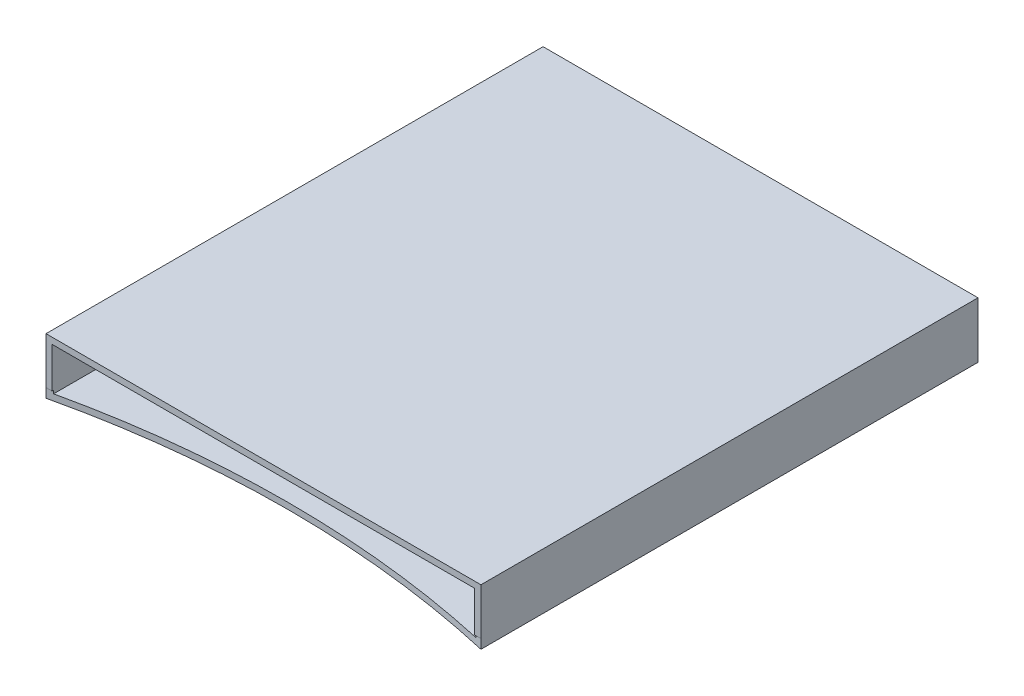
ISO-10303-21;
HEADER;
FILE_DESCRIPTION(('STEP AP214'),'2;1');
FILE_NAME('part.step','',(''),(''),'','','');
FILE_SCHEMA(('AUTOMOTIVE_DESIGN { 1 0 10303 214 1 1 1 1 }'));
ENDSEC;
DATA;
#1=APPLICATION_CONTEXT('core data for automotive mechanical design processes');
#2=APPLICATION_PROTOCOL_DEFINITION('international standard','automotive_design',2000,#1);
#3=PRODUCT_CONTEXT('',#1,'mechanical');
#4=PRODUCT('Part','Part','',(#3));
#5=PRODUCT_RELATED_PRODUCT_CATEGORY('part','',(#4));
#6=PRODUCT_DEFINITION_FORMATION('','',#4);
#7=PRODUCT_DEFINITION_CONTEXT('part definition',#1,'design');
#8=PRODUCT_DEFINITION('design','',#6,#7);
#9=PRODUCT_DEFINITION_SHAPE('','',#8);
#10=(LENGTH_UNIT() NAMED_UNIT(*) SI_UNIT(.MILLI.,.METRE.));
#11=(NAMED_UNIT(*) PLANE_ANGLE_UNIT() SI_UNIT($,.RADIAN.));
#12=(NAMED_UNIT(*) SI_UNIT($,.STERADIAN.) SOLID_ANGLE_UNIT());
#13=UNCERTAINTY_MEASURE_WITH_UNIT(LENGTH_MEASURE(1.E-05),#10,'distance_accuracy_value','');
#14=(GEOMETRIC_REPRESENTATION_CONTEXT(3) GLOBAL_UNCERTAINTY_ASSIGNED_CONTEXT((#13)) GLOBAL_UNIT_ASSIGNED_CONTEXT((#10,
#11,#12)) REPRESENTATION_CONTEXT('',''));
#15=CARTESIAN_POINT('',(0.,0.,0.));
#16=DIRECTION('',(0.,0.,1.));
#17=DIRECTION('',(1.,0.,0.));
#18=AXIS2_PLACEMENT_3D('',#15,#16,#17);
#19=CARTESIAN_POINT('',(-6.99999999999999,1.8,8.));
#20=DIRECTION('',(0.,0.,-1.));
#21=DIRECTION('',(-1.,0.,0.));
#22=AXIS2_PLACEMENT_3D('',#19,#20,#21);
#23=PLANE('',#22);
#24=DIRECTION('',(0.,-1.,0.));
#25=VECTOR('',#24,1.);
#26=CARTESIAN_POINT('',(-6.99999999999999,1.8,8.));
#27=LINE('',#26,#25);
#28=CARTESIAN_POINT('',(-6.99999999999999,1.8,8.));
#29=VERTEX_POINT('',#28);
#30=CARTESIAN_POINT('',(-6.99999999999999,0.3,8.));
#31=VERTEX_POINT('',#30);
#32=EDGE_CURVE('E163',#29,#31,#27,.T.);
#33=ORIENTED_EDGE('',*,*,#32,.T.);
#34=DIRECTION('',(-1.,0.,0.));
#35=VECTOR('',#34,1.);
#36=CARTESIAN_POINT('',(7.,0.3,8.));
#37=LINE('',#36,#35);
#38=CARTESIAN_POINT('',(-6.79999999999999,0.3,8.));
#39=VERTEX_POINT('',#38);
#40=EDGE_CURVE('E262',#39,#31,#37,.T.);
#41=ORIENTED_EDGE('',*,*,#40,.F.);
#42=DIRECTION('',(0.,-1.,0.));
#43=VECTOR('',#42,1.);
#44=CARTESIAN_POINT('',(-6.79999999999999,1.8,8.));
#45=LINE('',#44,#43);
#46=CARTESIAN_POINT('',(-6.79999999999999,1.6,8.));
#47=VERTEX_POINT('',#46);
#48=EDGE_CURVE('E145',#47,#39,#45,.T.);
#49=ORIENTED_EDGE('',*,*,#48,.F.);
#50=DIRECTION('',(1.,0.,0.));
#51=VECTOR('',#50,1.);
#52=CARTESIAN_POINT('',(-6.99999999999999,1.6,8.));
#53=LINE('',#52,#51);
#54=CARTESIAN_POINT('',(6.80000000000001,1.6,8.));
#55=VERTEX_POINT('',#54);
#56=EDGE_CURVE('E187',#47,#55,#53,.T.);
#57=ORIENTED_EDGE('',*,*,#56,.T.);
#58=DIRECTION('',(0.,-1.,0.));
#59=VECTOR('',#58,1.);
#60=CARTESIAN_POINT('',(6.80000000000001,1.8,8.));
#61=LINE('',#60,#59);
#62=CARTESIAN_POINT('',(6.80000000000001,0.3,8.));
#63=VERTEX_POINT('',#62);
#64=EDGE_CURVE('E196',#55,#63,#61,.T.);
#65=ORIENTED_EDGE('',*,*,#64,.T.);
#66=CARTESIAN_POINT('',(7.,0.3,8.));
#67=VERTEX_POINT('',#66);
#68=EDGE_CURVE('E136',#67,#63,#37,.T.);
#69=ORIENTED_EDGE('',*,*,#68,.F.);
#70=DIRECTION('',(0.,-1.,0.));
#71=VECTOR('',#70,1.);
#72=CARTESIAN_POINT('',(7.,1.8,8.));
#73=LINE('',#72,#71);
#74=CARTESIAN_POINT('',(7.,1.8,8.));
#75=VERTEX_POINT('',#74);
#76=EDGE_CURVE('E135',#75,#67,#73,.T.);
#77=ORIENTED_EDGE('',*,*,#76,.F.);
#78=DIRECTION('',(1.,0.,0.));
#79=VECTOR('',#78,1.);
#80=CARTESIAN_POINT('',(-6.99999999999999,1.8,8.));
#81=LINE('',#80,#79);
#82=EDGE_CURVE('E151',#29,#75,#81,.T.);
#83=ORIENTED_EDGE('',*,*,#82,.F.);
#84=EDGE_LOOP('',(#33,#41,#49,#57,#65,#69,#77,#83));
#85=FACE_BOUND('',#84,.T.);
#86=ADVANCED_FACE('F29',(#85),#23,.F.);
#87=CARTESIAN_POINT('',(-6.99999999999999,1.8,-8.));
#88=DIRECTION('',(1.,0.,0.));
#89=DIRECTION('',(0.,0.,-1.));
#90=AXIS2_PLACEMENT_3D('',#87,#88,#89);
#91=PLANE('',#90);
#92=DIRECTION('',(0.,0.,1.));
#93=VECTOR('',#92,1.);
#94=CARTESIAN_POINT('',(-6.99999999999999,0.,-8.));
#95=LINE('',#94,#93);
#96=CARTESIAN_POINT('',(-6.99999999999999,0.,-8.));
#97=VERTEX_POINT('',#96);
#98=CARTESIAN_POINT('',(-6.99999999999999,0.,8.));
#99=VERTEX_POINT('',#98);
#100=EDGE_CURVE('E141',#97,#99,#95,.T.);
#101=ORIENTED_EDGE('',*,*,#100,.T.);
#102=DIRECTION('',(0.,-1.,0.));
#103=VECTOR('',#102,1.);
#104=CARTESIAN_POINT('',(-6.99999999999999,0.3,8.));
#105=LINE('',#104,#103);
#106=EDGE_CURVE('E120',#31,#99,#105,.T.);
#107=ORIENTED_EDGE('',*,*,#106,.F.);
#108=ORIENTED_EDGE('',*,*,#32,.F.);
#109=DIRECTION('',(0.,0.,1.));
#110=VECTOR('',#109,1.);
#111=CARTESIAN_POINT('',(-6.99999999999999,1.8,-8.));
#112=LINE('',#111,#110);
#113=CARTESIAN_POINT('',(-6.99999999999999,1.8,-8.));
#114=VERTEX_POINT('',#113);
#115=EDGE_CURVE('E143',#114,#29,#112,.T.);
#116=ORIENTED_EDGE('',*,*,#115,.F.);
#117=DIRECTION('',(0.,-1.,0.));
#118=VECTOR('',#117,1.);
#119=CARTESIAN_POINT('',(-6.99999999999999,1.8,-8.));
#120=LINE('',#119,#118);
#121=EDGE_CURVE('E157',#114,#97,#120,.T.);
#122=ORIENTED_EDGE('',*,*,#121,.T.);
#123=EDGE_LOOP('',(#101,#107,#108,#116,#122));
#124=FACE_BOUND('',#123,.T.);
#125=ADVANCED_FACE('F31',(#124),#91,.F.);
#126=CARTESIAN_POINT('',(7.00000000000001,1.8,-8.));
#127=DIRECTION('',(-1.,0.,0.));
#128=DIRECTION('',(0.,0.,1.));
#129=AXIS2_PLACEMENT_3D('',#126,#127,#128);
#130=PLANE('',#129);
#131=DIRECTION('',(0.,0.,-1.));
#132=VECTOR('',#131,1.);
#133=CARTESIAN_POINT('',(7.00000000000001,0.,-8.));
#134=LINE('',#133,#132);
#135=CARTESIAN_POINT('',(7.,0.,8.));
#136=VERTEX_POINT('',#135);
#137=CARTESIAN_POINT('',(7.00000000000001,0.,-8.));
#138=VERTEX_POINT('',#137);
#139=EDGE_CURVE('E131',#136,#138,#134,.T.);
#140=ORIENTED_EDGE('',*,*,#139,.T.);
#141=DIRECTION('',(0.,-1.,0.));
#142=VECTOR('',#141,1.);
#143=CARTESIAN_POINT('',(7.00000000000001,1.8,-8.));
#144=LINE('',#143,#142);
#145=CARTESIAN_POINT('',(7.00000000000001,1.8,-8.));
#146=VERTEX_POINT('',#145);
#147=EDGE_CURVE('E160',#146,#138,#144,.T.);
#148=ORIENTED_EDGE('',*,*,#147,.F.);
#149=DIRECTION('',(0.,0.,-1.));
#150=VECTOR('',#149,1.);
#151=CARTESIAN_POINT('',(7.00000000000001,1.8,-8.));
#152=LINE('',#151,#150);
#153=EDGE_CURVE('E153',#75,#146,#152,.T.);
#154=ORIENTED_EDGE('',*,*,#153,.F.);
#155=ORIENTED_EDGE('',*,*,#76,.T.);
#156=DIRECTION('',(0.,-1.,0.));
#157=VECTOR('',#156,1.);
#158=CARTESIAN_POINT('',(7.,0.3,8.));
#159=LINE('',#158,#157);
#160=EDGE_CURVE('E116',#67,#136,#159,.T.);
#161=ORIENTED_EDGE('',*,*,#160,.T.);
#162=EDGE_LOOP('',(#140,#148,#154,#155,#161));
#163=FACE_BOUND('',#162,.T.);
#164=ADVANCED_FACE('F129',(#163),#130,.F.);
#165=CARTESIAN_POINT('',(-6.99999999999999,1.8,-8.));
#166=DIRECTION('',(0.,0.,1.));
#167=DIRECTION('',(1.,0.,0.));
#168=AXIS2_PLACEMENT_3D('',#165,#166,#167);
#169=PLANE('',#168);
#170=DIRECTION('',(-1.,0.,0.));
#171=VECTOR('',#170,1.);
#172=CARTESIAN_POINT('',(-6.99999999999999,0.,-8.));
#173=LINE('',#172,#171);
#174=EDGE_CURVE('E140',#138,#97,#173,.T.);
#175=ORIENTED_EDGE('',*,*,#174,.T.);
#176=ORIENTED_EDGE('',*,*,#121,.F.);
#177=DIRECTION('',(-1.,0.,0.));
#178=VECTOR('',#177,1.);
#179=CARTESIAN_POINT('',(-6.99999999999999,1.8,-8.));
#180=LINE('',#179,#178);
#181=EDGE_CURVE('E155',#146,#114,#180,.T.);
#182=ORIENTED_EDGE('',*,*,#181,.F.);
#183=ORIENTED_EDGE('',*,*,#147,.T.);
#184=EDGE_LOOP('',(#175,#176,#182,#183));
#185=FACE_BOUND('',#184,.T.);
#186=ADVANCED_FACE('F232',(#185),#169,.F.);
#187=CARTESIAN_POINT('',(-6.99999999999999,1.8,-8.));
#188=DIRECTION('',(0.,1.,0.));
#189=DIRECTION('',(0.,0.,1.));
#190=AXIS2_PLACEMENT_3D('',#187,#188,#189);
#191=PLANE('',#190);
#192=ORIENTED_EDGE('',*,*,#115,.T.);
#193=ORIENTED_EDGE('',*,*,#82,.T.);
#194=ORIENTED_EDGE('',*,*,#153,.T.);
#195=ORIENTED_EDGE('',*,*,#181,.T.);
#196=EDGE_LOOP('',(#192,#193,#194,#195));
#197=FACE_BOUND('',#196,.T.);
#198=ADVANCED_FACE('F235',(#197),#191,.T.);
#199=CARTESIAN_POINT('',(-6.99999999999999,0.,-8.));
#200=DIRECTION('',(0.,1.,0.));
#201=DIRECTION('',(0.,0.,1.));
#202=AXIS2_PLACEMENT_3D('',#199,#200,#201);
#203=PLANE('',#202);
#204=ORIENTED_EDGE('',*,*,#139,.F.);
#205=CARTESIAN_POINT('',(0.,0.,38.5220015265287));
#206=DIRECTION('',(0.,-1.,0.));
#207=DIRECTION('',(0.,0.,1.));
#208=AXIS2_PLACEMENT_3D('',#205,#206,#207);
#209=CIRCLE('',#208,31.3144148466073);
#210=EDGE_CURVE('E113',#99,#136,#209,.T.);
#211=ORIENTED_EDGE('',*,*,#210,.F.);
#212=ORIENTED_EDGE('',*,*,#100,.F.);
#213=ORIENTED_EDGE('',*,*,#174,.F.);
#214=EDGE_LOOP('',(#204,#211,#212,#213));
#215=FACE_BOUND('',#214,.T.);
#216=ADVANCED_FACE('F139',(#215),#203,.F.);
#217=CARTESIAN_POINT('',(-6.8,1.8,-8.));
#218=DIRECTION('',(1.,0.,0.));
#219=DIRECTION('',(0.,0.,-1.));
#220=AXIS2_PLACEMENT_3D('',#217,#218,#219);
#221=PLANE('',#220);
#222=DIRECTION('',(0.,-1.,0.));
#223=VECTOR('',#222,1.);
#224=CARTESIAN_POINT('',(-6.79999999999999,0.3,7.95482015196588));
#225=LINE('',#224,#223);
#226=CARTESIAN_POINT('',(-6.79999999999999,0.2,7.95482015196588));
#227=VERTEX_POINT('',#226);
#228=CARTESIAN_POINT('',(-6.79999999999999,0.3,7.95482015196588));
#229=VERTEX_POINT('',#228);
#230=EDGE_CURVE('E166',#227,#229,#225,.F.);
#231=ORIENTED_EDGE('',*,*,#230,.F.);
#232=DIRECTION('',(0.,0.,1.));
#233=VECTOR('',#232,1.);
#234=CARTESIAN_POINT('',(-6.8,0.2,-8.));
#235=LINE('',#234,#233);
#236=CARTESIAN_POINT('',(-6.8,0.2,-7.8));
#237=VERTEX_POINT('',#236);
#238=EDGE_CURVE('E174',#237,#227,#235,.T.);
#239=ORIENTED_EDGE('',*,*,#238,.F.);
#240=DIRECTION('',(0.,-1.,0.));
#241=VECTOR('',#240,1.);
#242=CARTESIAN_POINT('',(-6.8,1.8,-7.8));
#243=LINE('',#242,#241);
#244=CARTESIAN_POINT('',(-6.8,1.6,-7.8));
#245=VERTEX_POINT('',#244);
#246=EDGE_CURVE('E188',#245,#237,#243,.T.);
#247=ORIENTED_EDGE('',*,*,#246,.F.);
#248=DIRECTION('',(0.,0.,1.));
#249=VECTOR('',#248,1.);
#250=CARTESIAN_POINT('',(-6.8,1.6,-8.));
#251=LINE('',#250,#249);
#252=EDGE_CURVE('E52',#245,#47,#251,.T.);
#253=ORIENTED_EDGE('',*,*,#252,.T.);
#254=ORIENTED_EDGE('',*,*,#48,.T.);
#255=DIRECTION('',(0.,0.,1.));
#256=VECTOR('',#255,1.);
#257=CARTESIAN_POINT('',(-6.8,0.3,-8.));
#258=LINE('',#257,#256);
#259=EDGE_CURVE('E175',#229,#39,#258,.T.);
#260=ORIENTED_EDGE('',*,*,#259,.F.);
#261=EDGE_LOOP('',(#231,#239,#247,#253,#254,#260));
#262=FACE_BOUND('',#261,.T.);
#263=ADVANCED_FACE('F173',(#262),#221,.T.);
#264=CARTESIAN_POINT('',(6.80000000000001,1.8,-8.));
#265=DIRECTION('',(-1.,0.,0.));
#266=DIRECTION('',(0.,0.,1.));
#267=AXIS2_PLACEMENT_3D('',#264,#265,#266);
#268=PLANE('',#267);
#269=DIRECTION('',(0.,-1.,0.));
#270=VECTOR('',#269,1.);
#271=CARTESIAN_POINT('',(6.80000000000001,0.3,7.95482015196588));
#272=LINE('',#271,#270);
#273=CARTESIAN_POINT('',(6.80000000000001,0.3,7.95482015196588));
#274=VERTEX_POINT('',#273);
#275=CARTESIAN_POINT('',(6.80000000000001,0.2,7.95482015196588));
#276=VERTEX_POINT('',#275);
#277=EDGE_CURVE('E44',#274,#276,#272,.T.);
#278=ORIENTED_EDGE('',*,*,#277,.F.);
#279=DIRECTION('',(0.,0.,-1.));
#280=VECTOR('',#279,1.);
#281=CARTESIAN_POINT('',(6.80000000000001,0.3,-8.));
#282=LINE('',#281,#280);
#283=EDGE_CURVE('E11',#63,#274,#282,.T.);
#284=ORIENTED_EDGE('',*,*,#283,.F.);
#285=ORIENTED_EDGE('',*,*,#64,.F.);
#286=DIRECTION('',(0.,0.,-1.));
#287=VECTOR('',#286,1.);
#288=CARTESIAN_POINT('',(6.80000000000001,1.6,-8.));
#289=LINE('',#288,#287);
#290=CARTESIAN_POINT('',(6.80000000000001,1.6,-7.8));
#291=VERTEX_POINT('',#290);
#292=EDGE_CURVE('E194',#55,#291,#289,.T.);
#293=ORIENTED_EDGE('',*,*,#292,.T.);
#294=DIRECTION('',(0.,-1.,0.));
#295=VECTOR('',#294,1.);
#296=CARTESIAN_POINT('',(6.80000000000001,1.8,-7.8));
#297=LINE('',#296,#295);
#298=CARTESIAN_POINT('',(6.80000000000001,0.2,-7.8));
#299=VERTEX_POINT('',#298);
#300=EDGE_CURVE('E190',#291,#299,#297,.T.);
#301=ORIENTED_EDGE('',*,*,#300,.T.);
#302=DIRECTION('',(0.,0.,-1.));
#303=VECTOR('',#302,1.);
#304=CARTESIAN_POINT('',(6.80000000000001,0.2,-8.));
#305=LINE('',#304,#303);
#306=EDGE_CURVE('E181',#276,#299,#305,.T.);
#307=ORIENTED_EDGE('',*,*,#306,.F.);
#308=EDGE_LOOP('',(#278,#284,#285,#293,#301,#307));
#309=FACE_BOUND('',#308,.T.);
#310=ADVANCED_FACE('F211',(#309),#268,.T.);
#311=CARTESIAN_POINT('',(-6.99999999999999,1.8,-7.8));
#312=DIRECTION('',(0.,0.,1.));
#313=DIRECTION('',(1.,0.,0.));
#314=AXIS2_PLACEMENT_3D('',#311,#312,#313);
#315=PLANE('',#314);
#316=DIRECTION('',(-1.,0.,0.));
#317=VECTOR('',#316,1.);
#318=CARTESIAN_POINT('',(-6.99999999999999,0.2,-7.8));
#319=LINE('',#318,#317);
#320=EDGE_CURVE('E179',#299,#237,#319,.T.);
#321=ORIENTED_EDGE('',*,*,#320,.F.);
#322=ORIENTED_EDGE('',*,*,#300,.F.);
#323=DIRECTION('',(-1.,0.,0.));
#324=VECTOR('',#323,1.);
#325=CARTESIAN_POINT('',(-6.99999999999999,1.6,-7.8));
#326=LINE('',#325,#324);
#327=EDGE_CURVE('E191',#291,#245,#326,.T.);
#328=ORIENTED_EDGE('',*,*,#327,.T.);
#329=ORIENTED_EDGE('',*,*,#246,.T.);
#330=EDGE_LOOP('',(#321,#322,#328,#329));
#331=FACE_BOUND('',#330,.T.);
#332=ADVANCED_FACE('F214',(#331),#315,.T.);
#333=CARTESIAN_POINT('',(-6.99999999999999,1.6,-8.));
#334=DIRECTION('',(0.,1.,0.));
#335=DIRECTION('',(0.,0.,1.));
#336=AXIS2_PLACEMENT_3D('',#333,#334,#335);
#337=PLANE('',#336);
#338=ORIENTED_EDGE('',*,*,#252,.F.);
#339=ORIENTED_EDGE('',*,*,#327,.F.);
#340=ORIENTED_EDGE('',*,*,#292,.F.);
#341=ORIENTED_EDGE('',*,*,#56,.F.);
#342=EDGE_LOOP('',(#338,#339,#340,#341));
#343=FACE_BOUND('',#342,.T.);
#344=ADVANCED_FACE('F207',(#343),#337,.F.);
#345=CARTESIAN_POINT('',(-6.99999999999999,0.2,-8.));
#346=DIRECTION('',(0.,1.,0.));
#347=DIRECTION('',(0.,0.,1.));
#348=AXIS2_PLACEMENT_3D('',#345,#346,#347);
#349=PLANE('',#348);
#350=CARTESIAN_POINT('',(0.,0.2,38.5220015265287));
#351=DIRECTION('',(0.,1.,0.));
#352=DIRECTION('',(0.,0.,1.));
#353=AXIS2_PLACEMENT_3D('',#350,#351,#352);
#354=CIRCLE('',#353,31.3144148466073);
#355=EDGE_CURVE('E37',#276,#227,#354,.T.);
#356=ORIENTED_EDGE('',*,*,#355,.F.);
#357=ORIENTED_EDGE('',*,*,#306,.T.);
#358=ORIENTED_EDGE('',*,*,#320,.T.);
#359=ORIENTED_EDGE('',*,*,#238,.T.);
#360=EDGE_LOOP('',(#356,#357,#358,#359));
#361=FACE_BOUND('',#360,.T.);
#362=ADVANCED_FACE('F177',(#361),#349,.T.);
#363=CARTESIAN_POINT('',(0.,0.3,38.5220015265287));
#364=DIRECTION('',(0.,1.,0.));
#365=DIRECTION('',(0.,0.,1.));
#366=AXIS2_PLACEMENT_3D('',#363,#364,#365);
#367=PLANE('',#366);
#368=ORIENTED_EDGE('',*,*,#259,.T.);
#369=ORIENTED_EDGE('',*,*,#40,.T.);
#370=CARTESIAN_POINT('',(0.,0.3,38.5220015265287));
#371=DIRECTION('',(0.,-1.,0.));
#372=DIRECTION('',(0.,0.,1.));
#373=AXIS2_PLACEMENT_3D('',#370,#371,#372);
#374=CIRCLE('',#373,31.3144148466073);
#375=EDGE_CURVE('E257',#31,#229,#374,.T.);
#376=ORIENTED_EDGE('',*,*,#375,.T.);
#377=EDGE_LOOP('',(#368,#369,#376));
#378=FACE_BOUND('',#377,.T.);
#379=ADVANCED_FACE('F242',(#378),#367,.F.);
#380=CARTESIAN_POINT('',(0.,0.3,38.5220015265287));
#381=DIRECTION('',(0.,-1.,0.));
#382=DIRECTION('',(0.,0.,-1.));
#383=AXIS2_PLACEMENT_3D('',#380,#381,#382);
#384=CYLINDRICAL_SURFACE('',#383,31.3144148466073);
#385=ORIENTED_EDGE('',*,*,#230,.T.);
#386=ORIENTED_EDGE('',*,*,#375,.F.);
#387=ORIENTED_EDGE('',*,*,#106,.T.);
#388=ORIENTED_EDGE('',*,*,#210,.T.);
#389=ORIENTED_EDGE('',*,*,#160,.F.);
#390=EDGE_CURVE('E125',#274,#67,#374,.T.);
#391=ORIENTED_EDGE('',*,*,#390,.F.);
#392=ORIENTED_EDGE('',*,*,#277,.T.);
#393=ORIENTED_EDGE('',*,*,#355,.T.);
#394=EDGE_LOOP('',(#385,#386,#387,#388,#389,#391,#392,#393));
#395=FACE_BOUND('',#394,.T.);
#396=ADVANCED_FACE('F115',(#395),#384,.F.);
#397=ORIENTED_EDGE('',*,*,#283,.T.);
#398=ORIENTED_EDGE('',*,*,#390,.T.);
#399=ORIENTED_EDGE('',*,*,#68,.T.);
#400=EDGE_LOOP('',(#397,#398,#399));
#401=FACE_BOUND('',#400,.T.);
#402=ADVANCED_FACE('F248',(#401),#367,.F.);
#403=CLOSED_SHELL('',(#86,#125,#164,#186,#198,#216,#263,#310,#332,#344,#362,#379,#396,#402));
#404=MANIFOLD_SOLID_BREP('B2',#403);
#405=ADVANCED_BREP_SHAPE_REPRESENTATION('',(#18,#404),#14);
#406=SHAPE_DEFINITION_REPRESENTATION(#9,#405);
ENDSEC;
END-ISO-10303-21;
